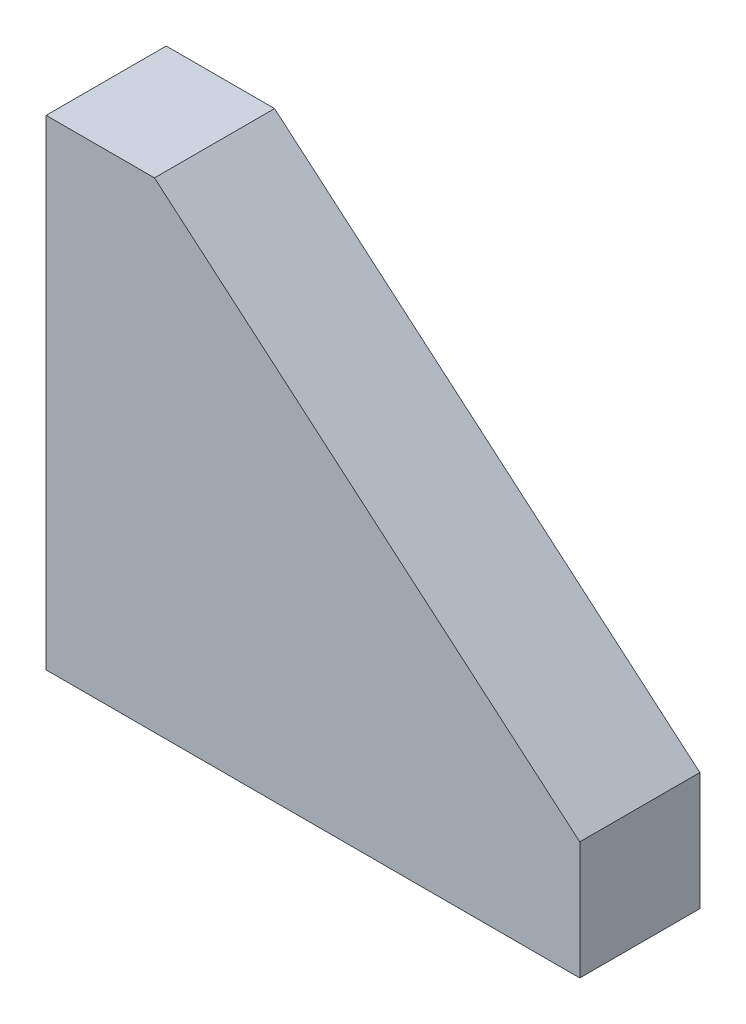
ISO-10303-21;
HEADER;
FILE_DESCRIPTION(('STEP AP214'),'2;1');
FILE_NAME('part.step','',(''),(''),'','','');
FILE_SCHEMA(('AUTOMOTIVE_DESIGN { 1 0 10303 214 1 1 1 1 }'));
ENDSEC;
DATA;
#1=APPLICATION_CONTEXT('core data for automotive mechanical design processes');
#2=APPLICATION_PROTOCOL_DEFINITION('international standard','automotive_design',2000,#1);
#3=PRODUCT_CONTEXT('',#1,'mechanical');
#4=PRODUCT('Part','Part','',(#3));
#5=PRODUCT_RELATED_PRODUCT_CATEGORY('part','',(#4));
#6=PRODUCT_DEFINITION_FORMATION('','',#4);
#7=PRODUCT_DEFINITION_CONTEXT('part definition',#1,'design');
#8=PRODUCT_DEFINITION('design','',#6,#7);
#9=PRODUCT_DEFINITION_SHAPE('','',#8);
#10=(LENGTH_UNIT() NAMED_UNIT(*) SI_UNIT(.MILLI.,.METRE.));
#11=(NAMED_UNIT(*) PLANE_ANGLE_UNIT() SI_UNIT($,.RADIAN.));
#12=(NAMED_UNIT(*) SI_UNIT($,.STERADIAN.) SOLID_ANGLE_UNIT());
#13=UNCERTAINTY_MEASURE_WITH_UNIT(LENGTH_MEASURE(1.E-05),#10,'distance_accuracy_value','');
#14=(GEOMETRIC_REPRESENTATION_CONTEXT(3) GLOBAL_UNCERTAINTY_ASSIGNED_CONTEXT((#13)) GLOBAL_UNIT_ASSIGNED_CONTEXT((#10,
#11,#12)) REPRESENTATION_CONTEXT('',''));
#15=CARTESIAN_POINT('',(0.,0.,0.));
#16=DIRECTION('',(0.,0.,1.));
#17=DIRECTION('',(1.,0.,0.));
#18=AXIS2_PLACEMENT_3D('',#15,#16,#17);
#19=CARTESIAN_POINT('',(0.,0.,5.715));
#20=DIRECTION('',(1.,0.,0.));
#21=DIRECTION('',(0.,0.,-1.));
#22=AXIS2_PLACEMENT_3D('',#19,#20,#21);
#23=PLANE('',#22);
#24=DIRECTION('',(0.,-1.,0.));
#25=VECTOR('',#24,1.);
#26=CARTESIAN_POINT('',(0.,0.,0.));
#27=LINE('',#26,#25);
#28=CARTESIAN_POINT('',(0.,22.86,0.));
#29=VERTEX_POINT('',#28);
#30=CARTESIAN_POINT('',(0.,0.,0.));
#31=VERTEX_POINT('',#30);
#32=EDGE_CURVE('E100',#29,#31,#27,.T.);
#33=ORIENTED_EDGE('',*,*,#32,.T.);
#34=DIRECTION('',(0.,0.,-1.));
#35=VECTOR('',#34,1.);
#36=CARTESIAN_POINT('',(0.,0.,5.715));
#37=LINE('',#36,#35);
#38=CARTESIAN_POINT('',(0.,0.,5.715));
#39=VERTEX_POINT('',#38);
#40=EDGE_CURVE('E11',#39,#31,#37,.T.);
#41=ORIENTED_EDGE('',*,*,#40,.F.);
#42=DIRECTION('',(0.,-1.,0.));
#43=VECTOR('',#42,1.);
#44=CARTESIAN_POINT('',(0.,0.,5.715));
#45=LINE('',#44,#43);
#46=CARTESIAN_POINT('',(0.,22.86,5.715));
#47=VERTEX_POINT('',#46);
#48=EDGE_CURVE('E110',#47,#39,#45,.T.);
#49=ORIENTED_EDGE('',*,*,#48,.F.);
#50=DIRECTION('',(0.,0.,-1.));
#51=VECTOR('',#50,1.);
#52=CARTESIAN_POINT('',(0.,22.86,5.715));
#53=LINE('',#52,#51);
#54=EDGE_CURVE('E120',#47,#29,#53,.T.);
#55=ORIENTED_EDGE('',*,*,#54,.T.);
#56=EDGE_LOOP('',(#33,#41,#49,#55));
#57=FACE_BOUND('',#56,.T.);
#58=ADVANCED_FACE('F39',(#57),#23,.F.);
#59=CARTESIAN_POINT('',(0.,0.,5.715));
#60=DIRECTION('',(0.,1.,0.));
#61=DIRECTION('',(0.,0.,1.));
#62=AXIS2_PLACEMENT_3D('',#59,#60,#61);
#63=PLANE('',#62);
#64=DIRECTION('',(1.,0.,0.));
#65=VECTOR('',#64,1.);
#66=CARTESIAN_POINT('',(0.,0.,0.));
#67=LINE('',#66,#65);
#68=CARTESIAN_POINT('',(25.4,0.,0.));
#69=VERTEX_POINT('',#68);
#70=EDGE_CURVE('E116',#31,#69,#67,.T.);
#71=ORIENTED_EDGE('',*,*,#70,.T.);
#72=DIRECTION('',(0.,0.,-1.));
#73=VECTOR('',#72,1.);
#74=CARTESIAN_POINT('',(25.4,0.,5.715));
#75=LINE('',#74,#73);
#76=CARTESIAN_POINT('',(25.4,0.,5.715));
#77=VERTEX_POINT('',#76);
#78=EDGE_CURVE('E47',#77,#69,#75,.T.);
#79=ORIENTED_EDGE('',*,*,#78,.F.);
#80=DIRECTION('',(1.,0.,0.));
#81=VECTOR('',#80,1.);
#82=CARTESIAN_POINT('',(0.,0.,5.715));
#83=LINE('',#82,#81);
#84=EDGE_CURVE('E86',#39,#77,#83,.T.);
#85=ORIENTED_EDGE('',*,*,#84,.F.);
#86=ORIENTED_EDGE('',*,*,#40,.T.);
#87=EDGE_LOOP('',(#71,#79,#85,#86));
#88=FACE_BOUND('',#87,.T.);
#89=ADVANCED_FACE('F131',(#88),#63,.F.);
#90=CARTESIAN_POINT('',(25.4,0.,5.715));
#91=DIRECTION('',(-1.,0.,0.));
#92=DIRECTION('',(0.,0.,1.));
#93=AXIS2_PLACEMENT_3D('',#90,#91,#92);
#94=PLANE('',#93);
#95=DIRECTION('',(0.,1.,0.));
#96=VECTOR('',#95,1.);
#97=CARTESIAN_POINT('',(25.4,0.,0.));
#98=LINE('',#97,#96);
#99=CARTESIAN_POINT('',(25.4,5.61238619442178,0.));
#100=VERTEX_POINT('',#99);
#101=EDGE_CURVE('E111',#69,#100,#98,.T.);
#102=ORIENTED_EDGE('',*,*,#101,.T.);
#103=DIRECTION('',(0.,0.,1.));
#104=VECTOR('',#103,1.);
#105=CARTESIAN_POINT('',(25.4,5.61238619442178,-0.00100000000000013));
#106=LINE('',#105,#104);
#107=CARTESIAN_POINT('',(25.4,5.61238619442178,5.715));
#108=VERTEX_POINT('',#107);
#109=EDGE_CURVE('E54',#100,#108,#106,.T.);
#110=ORIENTED_EDGE('',*,*,#109,.T.);
#111=DIRECTION('',(0.,1.,0.));
#112=VECTOR('',#111,1.);
#113=CARTESIAN_POINT('',(25.4,0.,5.715));
#114=LINE('',#113,#112);
#115=EDGE_CURVE('E128',#77,#108,#114,.T.);
#116=ORIENTED_EDGE('',*,*,#115,.F.);
#117=ORIENTED_EDGE('',*,*,#78,.T.);
#118=EDGE_LOOP('',(#102,#110,#116,#117));
#119=FACE_BOUND('',#118,.T.);
#120=ADVANCED_FACE('F126',(#119),#94,.F.);
#121=CARTESIAN_POINT('',(0.,22.86,5.715));
#122=DIRECTION('',(0.,-1.,0.));
#123=DIRECTION('',(0.,0.,-1.));
#124=AXIS2_PLACEMENT_3D('',#121,#122,#123);
#125=PLANE('',#124);
#126=DIRECTION('',(-1.,0.,0.));
#127=VECTOR('',#126,1.);
#128=CARTESIAN_POINT('',(0.,22.86,5.715));
#129=LINE('',#128,#127);
#130=CARTESIAN_POINT('',(5.1571627900089,22.86,5.715));
#131=VERTEX_POINT('',#130);
#132=EDGE_CURVE('E63',#131,#47,#129,.T.);
#133=ORIENTED_EDGE('',*,*,#132,.F.);
#134=DIRECTION('',(0.,0.,1.));
#135=VECTOR('',#134,1.);
#136=CARTESIAN_POINT('',(5.1571627900089,22.86,-0.00100000000000013));
#137=LINE('',#136,#135);
#138=CARTESIAN_POINT('',(5.1571627900089,22.86,0.));
#139=VERTEX_POINT('',#138);
#140=EDGE_CURVE('E95',#139,#131,#137,.T.);
#141=ORIENTED_EDGE('',*,*,#140,.F.);
#142=DIRECTION('',(-1.,0.,0.));
#143=VECTOR('',#142,1.);
#144=CARTESIAN_POINT('',(0.,22.86,0.));
#145=LINE('',#144,#143);
#146=EDGE_CURVE('E81',#139,#29,#145,.T.);
#147=ORIENTED_EDGE('',*,*,#146,.T.);
#148=ORIENTED_EDGE('',*,*,#54,.F.);
#149=EDGE_LOOP('',(#133,#141,#147,#148));
#150=FACE_BOUND('',#149,.T.);
#151=ADVANCED_FACE('F102',(#150),#125,.F.);
#152=CARTESIAN_POINT('',(0.,0.,5.715));
#153=DIRECTION('',(0.,0.,-1.));
#154=DIRECTION('',(-1.,0.,0.));
#155=AXIS2_PLACEMENT_3D('',#152,#153,#154);
#156=PLANE('',#155);
#157=ORIENTED_EDGE('',*,*,#115,.T.);
#158=DIRECTION('',(0.761174260330597,-0.648547411844476,0.));
#159=VECTOR('',#158,1.);
#160=CARTESIAN_POINT('',(5.1571627900089,22.86,5.715));
#161=LINE('',#160,#159);
#162=EDGE_CURVE('E104',#131,#108,#161,.T.);
#163=ORIENTED_EDGE('',*,*,#162,.F.);
#164=ORIENTED_EDGE('',*,*,#132,.T.);
#165=ORIENTED_EDGE('',*,*,#48,.T.);
#166=ORIENTED_EDGE('',*,*,#84,.T.);
#167=EDGE_LOOP('',(#157,#163,#164,#165,#166));
#168=FACE_BOUND('',#167,.T.);
#169=ADVANCED_FACE('F146',(#168),#156,.F.);
#170=CARTESIAN_POINT('',(0.,0.,0.));
#171=DIRECTION('',(0.,0.,-1.));
#172=DIRECTION('',(-1.,0.,0.));
#173=AXIS2_PLACEMENT_3D('',#170,#171,#172);
#174=PLANE('',#173);
#175=DIRECTION('',(0.761174260330597,-0.648547411844476,0.));
#176=VECTOR('',#175,1.);
#177=CARTESIAN_POINT('',(5.1571627900089,22.86,0.));
#178=LINE('',#177,#176);
#179=EDGE_CURVE('E93',#139,#100,#178,.T.);
#180=ORIENTED_EDGE('',*,*,#179,.T.);
#181=ORIENTED_EDGE('',*,*,#101,.F.);
#182=ORIENTED_EDGE('',*,*,#70,.F.);
#183=ORIENTED_EDGE('',*,*,#32,.F.);
#184=ORIENTED_EDGE('',*,*,#146,.F.);
#185=EDGE_LOOP('',(#180,#181,#182,#183,#184));
#186=FACE_BOUND('',#185,.T.);
#187=ADVANCED_FACE('F107',(#186),#174,.T.);
#188=CARTESIAN_POINT('',(5.1571627900089,22.86,-0.00100000000000013));
#189=DIRECTION('',(-0.648547411844476,-0.761174260330597,0.));
#190=DIRECTION('',(0.761174260330597,-0.648547411844476,0.));
#191=AXIS2_PLACEMENT_3D('',#188,#189,#190);
#192=PLANE('',#191);
#193=ORIENTED_EDGE('',*,*,#140,.T.);
#194=ORIENTED_EDGE('',*,*,#162,.T.);
#195=ORIENTED_EDGE('',*,*,#109,.F.);
#196=ORIENTED_EDGE('',*,*,#179,.F.);
#197=EDGE_LOOP('',(#193,#194,#195,#196));
#198=FACE_BOUND('',#197,.T.);
#199=ADVANCED_FACE('F94',(#198),#192,.F.);
#200=CLOSED_SHELL('',(#58,#89,#120,#151,#169,#187,#199));
#201=MANIFOLD_SOLID_BREP('B2',#200);
#202=ADVANCED_BREP_SHAPE_REPRESENTATION('',(#18,#201),#14);
#203=SHAPE_DEFINITION_REPRESENTATION(#9,#202);
ENDSEC;
END-ISO-10303-21;
